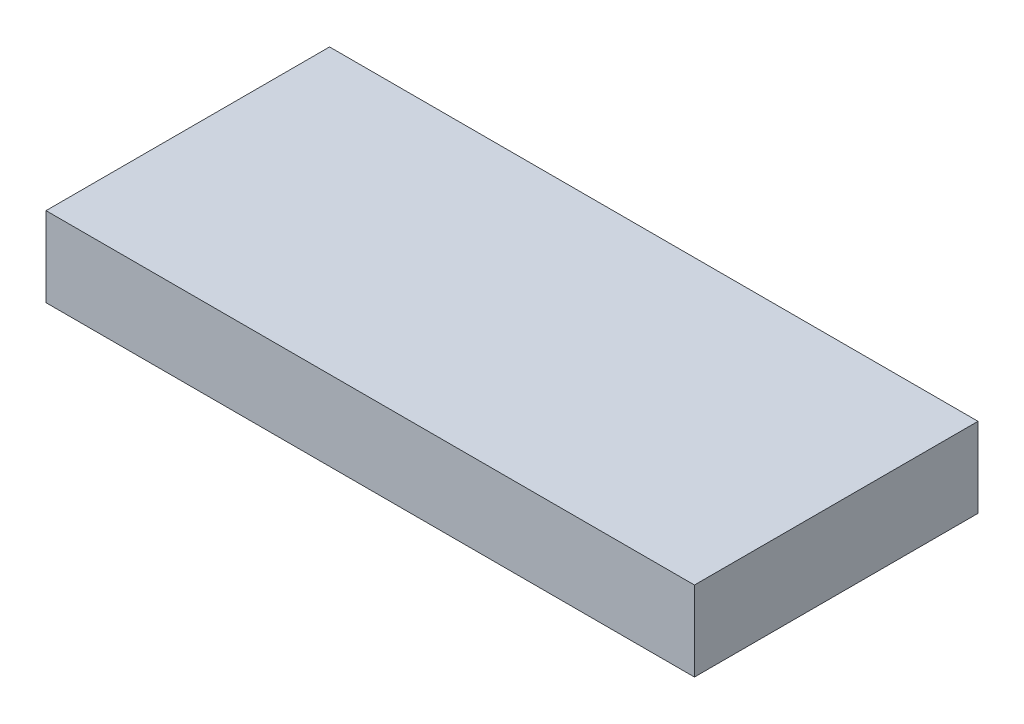
ISO-10303-21;
HEADER;
FILE_DESCRIPTION(('STEP AP214'),'2;1');
FILE_NAME('part.step','',(''),(''),'','','');
FILE_SCHEMA(('AUTOMOTIVE_DESIGN { 1 0 10303 214 1 1 1 1 }'));
ENDSEC;
DATA;
#1=APPLICATION_CONTEXT('core data for automotive mechanical design processes');
#2=APPLICATION_PROTOCOL_DEFINITION('international standard','automotive_design',2000,#1);
#3=PRODUCT_CONTEXT('',#1,'mechanical');
#4=PRODUCT('Part','Part','',(#3));
#5=PRODUCT_RELATED_PRODUCT_CATEGORY('part','',(#4));
#6=PRODUCT_DEFINITION_FORMATION('','',#4);
#7=PRODUCT_DEFINITION_CONTEXT('part definition',#1,'design');
#8=PRODUCT_DEFINITION('design','',#6,#7);
#9=PRODUCT_DEFINITION_SHAPE('','',#8);
#10=(LENGTH_UNIT() NAMED_UNIT(*) SI_UNIT(.MILLI.,.METRE.));
#11=(NAMED_UNIT(*) PLANE_ANGLE_UNIT() SI_UNIT($,.RADIAN.));
#12=(NAMED_UNIT(*) SI_UNIT($,.STERADIAN.) SOLID_ANGLE_UNIT());
#13=UNCERTAINTY_MEASURE_WITH_UNIT(LENGTH_MEASURE(1.E-05),#10,'distance_accuracy_value','');
#14=(GEOMETRIC_REPRESENTATION_CONTEXT(3) GLOBAL_UNCERTAINTY_ASSIGNED_CONTEXT((#13)) GLOBAL_UNIT_ASSIGNED_CONTEXT((#10,
#11,#12)) REPRESENTATION_CONTEXT('',''));
#15=CARTESIAN_POINT('',(0.,0.,0.));
#16=DIRECTION('',(0.,0.,1.));
#17=DIRECTION('',(1.,0.,0.));
#18=AXIS2_PLACEMENT_3D('',#15,#16,#17);
#19=CARTESIAN_POINT('',(0.,50.,0.));
#20=DIRECTION('',(1.,0.,0.));
#21=DIRECTION('',(0.,0.,-1.));
#22=AXIS2_PLACEMENT_3D('',#19,#20,#21);
#23=PLANE('',#22);
#24=DIRECTION('',(0.,0.,1.));
#25=VECTOR('',#24,1.);
#26=CARTESIAN_POINT('',(0.,0.,0.));
#27=LINE('',#26,#25);
#28=CARTESIAN_POINT('',(0.,0.,-177.8));
#29=VERTEX_POINT('',#28);
#30=CARTESIAN_POINT('',(0.,0.,0.));
#31=VERTEX_POINT('',#30);
#32=EDGE_CURVE('E113',#29,#31,#27,.T.);
#33=ORIENTED_EDGE('',*,*,#32,.T.);
#34=DIRECTION('',(0.,-1.,0.));
#35=VECTOR('',#34,1.);
#36=CARTESIAN_POINT('',(0.,50.,0.));
#37=LINE('',#36,#35);
#38=CARTESIAN_POINT('',(0.,50.,0.));
#39=VERTEX_POINT('',#38);
#40=EDGE_CURVE('E11',#39,#31,#37,.T.);
#41=ORIENTED_EDGE('',*,*,#40,.F.);
#42=DIRECTION('',(0.,0.,1.));
#43=VECTOR('',#42,1.);
#44=CARTESIAN_POINT('',(0.,50.,0.));
#45=LINE('',#44,#43);
#46=CARTESIAN_POINT('',(0.,50.,-177.8));
#47=VERTEX_POINT('',#46);
#48=EDGE_CURVE('E97',#47,#39,#45,.T.);
#49=ORIENTED_EDGE('',*,*,#48,.F.);
#50=DIRECTION('',(0.,-1.,0.));
#51=VECTOR('',#50,1.);
#52=CARTESIAN_POINT('',(0.,50.,-177.8));
#53=LINE('',#52,#51);
#54=EDGE_CURVE('E109',#47,#29,#53,.T.);
#55=ORIENTED_EDGE('',*,*,#54,.T.);
#56=EDGE_LOOP('',(#33,#41,#49,#55));
#57=FACE_BOUND('',#56,.T.);
#58=ADVANCED_FACE('F45',(#57),#23,.F.);
#59=CARTESIAN_POINT('',(0.,50.,0.));
#60=DIRECTION('',(0.,0.,-1.));
#61=DIRECTION('',(-1.,0.,0.));
#62=AXIS2_PLACEMENT_3D('',#59,#60,#61);
#63=PLANE('',#62);
#64=DIRECTION('',(1.,0.,0.));
#65=VECTOR('',#64,1.);
#66=CARTESIAN_POINT('',(0.,0.,0.));
#67=LINE('',#66,#65);
#68=CARTESIAN_POINT('',(406.6,0.,0.));
#69=VERTEX_POINT('',#68);
#70=EDGE_CURVE('E102',#31,#69,#67,.T.);
#71=ORIENTED_EDGE('',*,*,#70,.T.);
#72=DIRECTION('',(0.,-1.,0.));
#73=VECTOR('',#72,1.);
#74=CARTESIAN_POINT('',(406.6,50.,0.));
#75=LINE('',#74,#73);
#76=CARTESIAN_POINT('',(406.6,50.,0.));
#77=VERTEX_POINT('',#76);
#78=EDGE_CURVE('E54',#77,#69,#75,.T.);
#79=ORIENTED_EDGE('',*,*,#78,.F.);
#80=DIRECTION('',(1.,0.,0.));
#81=VECTOR('',#80,1.);
#82=CARTESIAN_POINT('',(0.,50.,0.));
#83=LINE('',#82,#81);
#84=EDGE_CURVE('E92',#39,#77,#83,.T.);
#85=ORIENTED_EDGE('',*,*,#84,.F.);
#86=ORIENTED_EDGE('',*,*,#40,.T.);
#87=EDGE_LOOP('',(#71,#79,#85,#86));
#88=FACE_BOUND('',#87,.T.);
#89=ADVANCED_FACE('F101',(#88),#63,.F.);
#90=CARTESIAN_POINT('',(406.6,50.,0.));
#91=DIRECTION('',(-1.,0.,0.));
#92=DIRECTION('',(0.,0.,1.));
#93=AXIS2_PLACEMENT_3D('',#90,#91,#92);
#94=PLANE('',#93);
#95=DIRECTION('',(0.,0.,-1.));
#96=VECTOR('',#95,1.);
#97=CARTESIAN_POINT('',(406.6,0.,0.));
#98=LINE('',#97,#96);
#99=CARTESIAN_POINT('',(406.6,0.,-177.8));
#100=VERTEX_POINT('',#99);
#101=EDGE_CURVE('E79',#69,#100,#98,.T.);
#102=ORIENTED_EDGE('',*,*,#101,.T.);
#103=DIRECTION('',(0.,-1.,0.));
#104=VECTOR('',#103,1.);
#105=CARTESIAN_POINT('',(406.6,50.,-177.8));
#106=LINE('',#105,#104);
#107=CARTESIAN_POINT('',(406.6,50.,-177.8));
#108=VERTEX_POINT('',#107);
#109=EDGE_CURVE('E104',#108,#100,#106,.T.);
#110=ORIENTED_EDGE('',*,*,#109,.F.);
#111=DIRECTION('',(0.,0.,-1.));
#112=VECTOR('',#111,1.);
#113=CARTESIAN_POINT('',(406.6,50.,0.));
#114=LINE('',#113,#112);
#115=EDGE_CURVE('E95',#77,#108,#114,.T.);
#116=ORIENTED_EDGE('',*,*,#115,.F.);
#117=ORIENTED_EDGE('',*,*,#78,.T.);
#118=EDGE_LOOP('',(#102,#110,#116,#117));
#119=FACE_BOUND('',#118,.T.);
#120=ADVANCED_FACE('F105',(#119),#94,.F.);
#121=CARTESIAN_POINT('',(0.,50.,-177.8));
#122=DIRECTION('',(0.,0.,1.));
#123=DIRECTION('',(1.,0.,0.));
#124=AXIS2_PLACEMENT_3D('',#121,#122,#123);
#125=PLANE('',#124);
#126=DIRECTION('',(-1.,0.,0.));
#127=VECTOR('',#126,1.);
#128=CARTESIAN_POINT('',(0.,0.,-177.8));
#129=LINE('',#128,#127);
#130=EDGE_CURVE('E85',#100,#29,#129,.T.);
#131=ORIENTED_EDGE('',*,*,#130,.T.);
#132=ORIENTED_EDGE('',*,*,#54,.F.);
#133=DIRECTION('',(-1.,0.,0.));
#134=VECTOR('',#133,1.);
#135=CARTESIAN_POINT('',(0.,50.,-177.8));
#136=LINE('',#135,#134);
#137=EDGE_CURVE('E62',#108,#47,#136,.T.);
#138=ORIENTED_EDGE('',*,*,#137,.F.);
#139=ORIENTED_EDGE('',*,*,#109,.T.);
#140=EDGE_LOOP('',(#131,#132,#138,#139));
#141=FACE_BOUND('',#140,.T.);
#142=ADVANCED_FACE('F126',(#141),#125,.F.);
#143=CARTESIAN_POINT('',(0.,50.,0.));
#144=DIRECTION('',(0.,-1.,0.));
#145=DIRECTION('',(0.,0.,-1.));
#146=AXIS2_PLACEMENT_3D('',#143,#144,#145);
#147=PLANE('',#146);
#148=ORIENTED_EDGE('',*,*,#48,.T.);
#149=ORIENTED_EDGE('',*,*,#84,.T.);
#150=ORIENTED_EDGE('',*,*,#115,.T.);
#151=ORIENTED_EDGE('',*,*,#137,.T.);
#152=EDGE_LOOP('',(#148,#149,#150,#151));
#153=FACE_BOUND('',#152,.T.);
#154=ADVANCED_FACE('F93',(#153),#147,.F.);
#155=CARTESIAN_POINT('',(0.,0.,0.));
#156=DIRECTION('',(0.,-1.,0.));
#157=DIRECTION('',(0.,0.,-1.));
#158=AXIS2_PLACEMENT_3D('',#155,#156,#157);
#159=PLANE('',#158);
#160=ORIENTED_EDGE('',*,*,#32,.F.);
#161=ORIENTED_EDGE('',*,*,#130,.F.);
#162=ORIENTED_EDGE('',*,*,#101,.F.);
#163=ORIENTED_EDGE('',*,*,#70,.F.);
#164=EDGE_LOOP('',(#160,#161,#162,#163));
#165=FACE_BOUND('',#164,.T.);
#166=ADVANCED_FACE('F129',(#165),#159,.T.);
#167=CLOSED_SHELL('',(#58,#89,#120,#142,#154,#166));
#168=MANIFOLD_SOLID_BREP('B2',#167);
#169=ADVANCED_BREP_SHAPE_REPRESENTATION('',(#18,#168),#14);
#170=SHAPE_DEFINITION_REPRESENTATION(#9,#169);
ENDSEC;
END-ISO-10303-21;
